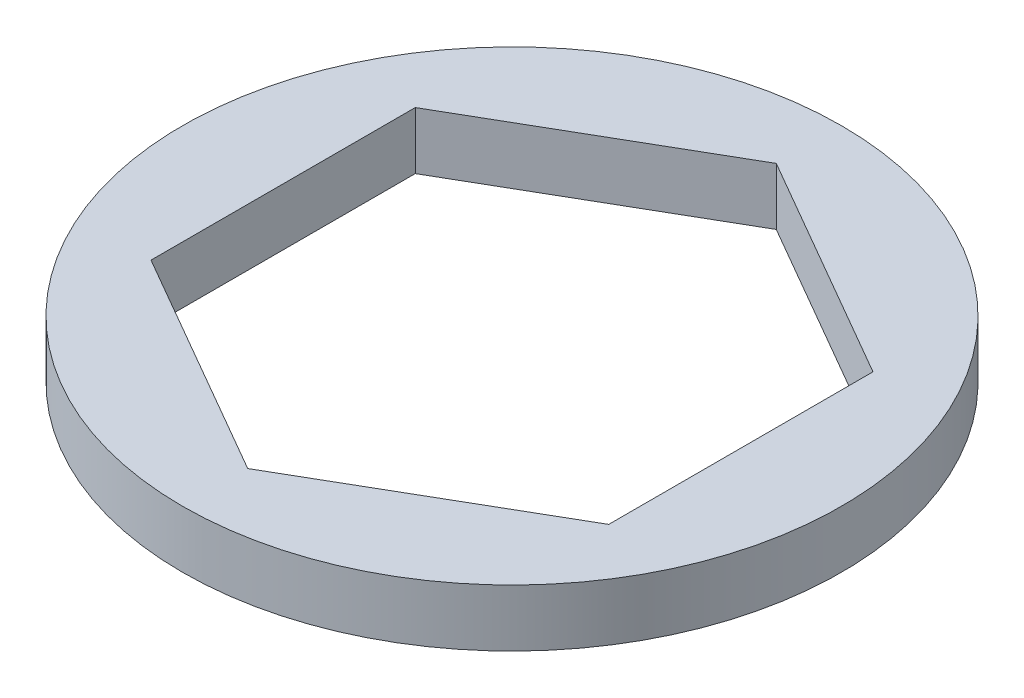
ISO-10303-21;
HEADER;
FILE_DESCRIPTION(('STEP AP214'),'2;1');
FILE_NAME('part.step','',(''),(''),'','','');
FILE_SCHEMA(('AUTOMOTIVE_DESIGN { 1 0 10303 214 1 1 1 1 }'));
ENDSEC;
DATA;
#1=APPLICATION_CONTEXT('core data for automotive mechanical design processes');
#2=APPLICATION_PROTOCOL_DEFINITION('international standard','automotive_design',2000,#1);
#3=PRODUCT_CONTEXT('',#1,'mechanical');
#4=PRODUCT('Part','Part','',(#3));
#5=PRODUCT_RELATED_PRODUCT_CATEGORY('part','',(#4));
#6=PRODUCT_DEFINITION_FORMATION('','',#4);
#7=PRODUCT_DEFINITION_CONTEXT('part definition',#1,'design');
#8=PRODUCT_DEFINITION('design','',#6,#7);
#9=PRODUCT_DEFINITION_SHAPE('','',#8);
#10=(LENGTH_UNIT() NAMED_UNIT(*) SI_UNIT(.MILLI.,.METRE.));
#11=(NAMED_UNIT(*) PLANE_ANGLE_UNIT() SI_UNIT($,.RADIAN.));
#12=(NAMED_UNIT(*) SI_UNIT($,.STERADIAN.) SOLID_ANGLE_UNIT());
#13=UNCERTAINTY_MEASURE_WITH_UNIT(LENGTH_MEASURE(1.E-05),#10,'distance_accuracy_value','');
#14=(GEOMETRIC_REPRESENTATION_CONTEXT(3) GLOBAL_UNCERTAINTY_ASSIGNED_CONTEXT((#13)) GLOBAL_UNIT_ASSIGNED_CONTEXT((#10,
#11,#12)) REPRESENTATION_CONTEXT('',''));
#15=CARTESIAN_POINT('',(0.,0.,0.));
#16=DIRECTION('',(0.,0.,1.));
#17=DIRECTION('',(1.,0.,0.));
#18=AXIS2_PLACEMENT_3D('',#15,#16,#17);
#19=CARTESIAN_POINT('',(0.,1.5875,0.));
#20=DIRECTION('',(0.,1.,0.));
#21=DIRECTION('',(0.,0.,1.));
#22=AXIS2_PLACEMENT_3D('',#19,#20,#21);
#23=PLANE('',#22);
#24=CARTESIAN_POINT('',(0.,1.5875,0.));
#25=DIRECTION('',(0.,1.,0.));
#26=DIRECTION('',(0.,0.,1.));
#27=AXIS2_PLACEMENT_3D('',#24,#25,#26);
#28=CIRCLE('',#27,9.144);
#29=CARTESIAN_POINT('',(0.,1.5875,9.144));
#30=VERTEX_POINT('',#29);
#31=EDGE_CURVE('E11',#30,#30,#28,.T.);
#32=ORIENTED_EDGE('',*,*,#31,.T.);
#33=EDGE_LOOP('',(#32));
#34=FACE_BOUND('',#33,.T.);
#35=DIRECTION('',(0.,0.,-1.));
#36=VECTOR('',#35,1.);
#37=CARTESIAN_POINT('',(6.35,1.5875,3.66617420935412));
#38=LINE('',#37,#36);
#39=CARTESIAN_POINT('',(6.35,1.5875,3.66617420935412));
#40=VERTEX_POINT('',#39);
#41=CARTESIAN_POINT('',(6.35,1.5875,-3.66617420935413));
#42=VERTEX_POINT('',#41);
#43=EDGE_CURVE('E106',#40,#42,#38,.T.);
#44=ORIENTED_EDGE('',*,*,#43,.F.);
#45=DIRECTION('',(0.866025403784438,0.,-0.5));
#46=VECTOR('',#45,1.);
#47=CARTESIAN_POINT('',(0.,1.5875,7.33234841870825));
#48=LINE('',#47,#46);
#49=CARTESIAN_POINT('',(0.,1.5875,7.33234841870825));
#50=VERTEX_POINT('',#49);
#51=EDGE_CURVE('E97',#50,#40,#48,.T.);
#52=ORIENTED_EDGE('',*,*,#51,.F.);
#53=DIRECTION('',(0.866025403784438,0.,0.5));
#54=VECTOR('',#53,1.);
#55=CARTESIAN_POINT('',(-6.35,1.5875,3.66617420935412));
#56=LINE('',#55,#54);
#57=CARTESIAN_POINT('',(-6.35,1.5875,3.66617420935412));
#58=VERTEX_POINT('',#57);
#59=EDGE_CURVE('E131',#58,#50,#56,.T.);
#60=ORIENTED_EDGE('',*,*,#59,.F.);
#61=DIRECTION('',(0.,0.,1.));
#62=VECTOR('',#61,1.);
#63=CARTESIAN_POINT('',(-6.35,1.5875,-3.66617420935412));
#64=LINE('',#63,#62);
#65=CARTESIAN_POINT('',(-6.35,1.5875,-3.66617420935412));
#66=VERTEX_POINT('',#65);
#67=EDGE_CURVE('E128',#66,#58,#64,.T.);
#68=ORIENTED_EDGE('',*,*,#67,.F.);
#69=DIRECTION('',(-0.866025403784439,0.,0.5));
#70=VECTOR('',#69,1.);
#71=CARTESIAN_POINT('',(0.,1.5875,-7.33234841870825));
#72=LINE('',#71,#70);
#73=CARTESIAN_POINT('',(0.,1.5875,-7.33234841870825));
#74=VERTEX_POINT('',#73);
#75=EDGE_CURVE('E123',#74,#66,#72,.T.);
#76=ORIENTED_EDGE('',*,*,#75,.F.);
#77=DIRECTION('',(-0.866025403784439,0.,-0.5));
#78=VECTOR('',#77,1.);
#79=CARTESIAN_POINT('',(6.35,1.5875,-3.66617420935413));
#80=LINE('',#79,#78);
#81=EDGE_CURVE('E119',#42,#74,#80,.T.);
#82=ORIENTED_EDGE('',*,*,#81,.F.);
#83=EDGE_LOOP('',(#44,#52,#60,#68,#76,#82));
#84=FACE_BOUND('',#83,.T.);
#85=ADVANCED_FACE('F43',(#34,#84),#23,.T.);
#86=CARTESIAN_POINT('',(0.,0.,0.));
#87=DIRECTION('',(0.,1.,0.));
#88=DIRECTION('',(0.,0.,1.));
#89=AXIS2_PLACEMENT_3D('',#86,#87,#88);
#90=PLANE('',#89);
#91=CARTESIAN_POINT('',(0.,0.,0.));
#92=DIRECTION('',(0.,1.,0.));
#93=DIRECTION('',(0.,0.,1.));
#94=AXIS2_PLACEMENT_3D('',#91,#92,#93);
#95=CIRCLE('',#94,9.144);
#96=CARTESIAN_POINT('',(0.,0.,9.144));
#97=VERTEX_POINT('',#96);
#98=EDGE_CURVE('E47',#97,#97,#95,.T.);
#99=ORIENTED_EDGE('',*,*,#98,.F.);
#100=EDGE_LOOP('',(#99));
#101=FACE_BOUND('',#100,.T.);
#102=DIRECTION('',(0.866025403784438,0.,-0.5));
#103=VECTOR('',#102,1.);
#104=CARTESIAN_POINT('',(0.,0.,7.33234841870825));
#105=LINE('',#104,#103);
#106=CARTESIAN_POINT('',(0.,0.,7.33234841870825));
#107=VERTEX_POINT('',#106);
#108=CARTESIAN_POINT('',(6.35,0.,3.66617420935412));
#109=VERTEX_POINT('',#108);
#110=EDGE_CURVE('E67',#107,#109,#105,.T.);
#111=ORIENTED_EDGE('',*,*,#110,.T.);
#112=DIRECTION('',(0.,0.,-1.));
#113=VECTOR('',#112,1.);
#114=CARTESIAN_POINT('',(6.35,0.,3.66617420935412));
#115=LINE('',#114,#113);
#116=CARTESIAN_POINT('',(6.35,0.,-3.66617420935413));
#117=VERTEX_POINT('',#116);
#118=EDGE_CURVE('E113',#109,#117,#115,.T.);
#119=ORIENTED_EDGE('',*,*,#118,.T.);
#120=DIRECTION('',(-0.866025403784439,0.,-0.5));
#121=VECTOR('',#120,1.);
#122=CARTESIAN_POINT('',(6.35,0.,-3.66617420935413));
#123=LINE('',#122,#121);
#124=CARTESIAN_POINT('',(0.,0.,-7.33234841870825));
#125=VERTEX_POINT('',#124);
#126=EDGE_CURVE('E138',#117,#125,#123,.T.);
#127=ORIENTED_EDGE('',*,*,#126,.T.);
#128=DIRECTION('',(-0.866025403784439,0.,0.5));
#129=VECTOR('',#128,1.);
#130=CARTESIAN_POINT('',(0.,0.,-7.33234841870825));
#131=LINE('',#130,#129);
#132=CARTESIAN_POINT('',(-6.35,0.,-3.66617420935412));
#133=VERTEX_POINT('',#132);
#134=EDGE_CURVE('E142',#125,#133,#131,.T.);
#135=ORIENTED_EDGE('',*,*,#134,.T.);
#136=DIRECTION('',(0.,0.,1.));
#137=VECTOR('',#136,1.);
#138=CARTESIAN_POINT('',(-6.35,0.,-3.66617420935412));
#139=LINE('',#138,#137);
#140=CARTESIAN_POINT('',(-6.35,0.,3.66617420935412));
#141=VERTEX_POINT('',#140);
#142=EDGE_CURVE('E146',#133,#141,#139,.T.);
#143=ORIENTED_EDGE('',*,*,#142,.T.);
#144=DIRECTION('',(0.866025403784438,0.,0.5));
#145=VECTOR('',#144,1.);
#146=CARTESIAN_POINT('',(-6.35,0.,3.66617420935412));
#147=LINE('',#146,#145);
#148=EDGE_CURVE('E107',#141,#107,#147,.T.);
#149=ORIENTED_EDGE('',*,*,#148,.T.);
#150=EDGE_LOOP('',(#111,#119,#127,#135,#143,#149));
#151=FACE_BOUND('',#150,.T.);
#152=ADVANCED_FACE('F170',(#101,#151),#90,.F.);
#153=CARTESIAN_POINT('',(0.,1.5875,0.));
#154=DIRECTION('',(0.,-1.,0.));
#155=DIRECTION('',(0.,0.,-1.));
#156=AXIS2_PLACEMENT_3D('',#153,#154,#155);
#157=CYLINDRICAL_SURFACE('',#156,9.144);
#158=ORIENTED_EDGE('',*,*,#31,.F.);
#159=EDGE_LOOP('',(#158));
#160=FACE_BOUND('',#159,.T.);
#161=ORIENTED_EDGE('',*,*,#98,.T.);
#162=EDGE_LOOP('',(#161));
#163=FACE_BOUND('',#162,.T.);
#164=ADVANCED_FACE('F45',(#160,#163),#157,.T.);
#165=CARTESIAN_POINT('',(0.,1.5875,7.33234841870825));
#166=DIRECTION('',(-0.5,0.,-0.866025403784438));
#167=DIRECTION('',(-0.866025403784438,0.,0.5));
#168=AXIS2_PLACEMENT_3D('',#165,#166,#167);
#169=PLANE('',#168);
#170=ORIENTED_EDGE('',*,*,#110,.F.);
#171=DIRECTION('',(0.,-1.,0.));
#172=VECTOR('',#171,1.);
#173=CARTESIAN_POINT('',(0.,1.5875,7.33234841870825));
#174=LINE('',#173,#172);
#175=EDGE_CURVE('E101',#50,#107,#174,.T.);
#176=ORIENTED_EDGE('',*,*,#175,.F.);
#177=ORIENTED_EDGE('',*,*,#51,.T.);
#178=DIRECTION('',(0.,-1.,0.));
#179=VECTOR('',#178,1.);
#180=CARTESIAN_POINT('',(6.35,1.5875,3.66617420935412));
#181=LINE('',#180,#179);
#182=EDGE_CURVE('E100',#40,#109,#181,.T.);
#183=ORIENTED_EDGE('',*,*,#182,.T.);
#184=EDGE_LOOP('',(#170,#176,#177,#183));
#185=FACE_BOUND('',#184,.T.);
#186=ADVANCED_FACE('F99',(#185),#169,.T.);
#187=CARTESIAN_POINT('',(6.35,1.5875,3.66617420935412));
#188=DIRECTION('',(-1.,0.,0.));
#189=DIRECTION('',(0.,0.,1.));
#190=AXIS2_PLACEMENT_3D('',#187,#188,#189);
#191=PLANE('',#190);
#192=ORIENTED_EDGE('',*,*,#118,.F.);
#193=ORIENTED_EDGE('',*,*,#182,.F.);
#194=ORIENTED_EDGE('',*,*,#43,.T.);
#195=DIRECTION('',(0.,-1.,0.));
#196=VECTOR('',#195,1.);
#197=CARTESIAN_POINT('',(6.35,1.5875,-3.66617420935413));
#198=LINE('',#197,#196);
#199=EDGE_CURVE('E115',#42,#117,#198,.T.);
#200=ORIENTED_EDGE('',*,*,#199,.T.);
#201=EDGE_LOOP('',(#192,#193,#194,#200));
#202=FACE_BOUND('',#201,.T.);
#203=ADVANCED_FACE('F110',(#202),#191,.T.);
#204=CARTESIAN_POINT('',(6.35,1.5875,-3.66617420935413));
#205=DIRECTION('',(-0.5,0.,0.866025403784439));
#206=DIRECTION('',(0.866025403784439,0.,0.5));
#207=AXIS2_PLACEMENT_3D('',#204,#205,#206);
#208=PLANE('',#207);
#209=ORIENTED_EDGE('',*,*,#126,.F.);
#210=ORIENTED_EDGE('',*,*,#199,.F.);
#211=ORIENTED_EDGE('',*,*,#81,.T.);
#212=DIRECTION('',(0.,-1.,0.));
#213=VECTOR('',#212,1.);
#214=CARTESIAN_POINT('',(0.,1.5875,-7.33234841870825));
#215=LINE('',#214,#213);
#216=EDGE_CURVE('E160',#74,#125,#215,.T.);
#217=ORIENTED_EDGE('',*,*,#216,.T.);
#218=EDGE_LOOP('',(#209,#210,#211,#217));
#219=FACE_BOUND('',#218,.T.);
#220=ADVANCED_FACE('F166',(#219),#208,.T.);
#221=CARTESIAN_POINT('',(0.,1.5875,-7.33234841870825));
#222=DIRECTION('',(0.5,0.,0.866025403784439));
#223=DIRECTION('',(0.866025403784439,0.,-0.5));
#224=AXIS2_PLACEMENT_3D('',#221,#222,#223);
#225=PLANE('',#224);
#226=ORIENTED_EDGE('',*,*,#134,.F.);
#227=ORIENTED_EDGE('',*,*,#216,.F.);
#228=ORIENTED_EDGE('',*,*,#75,.T.);
#229=DIRECTION('',(0.,-1.,0.));
#230=VECTOR('',#229,1.);
#231=CARTESIAN_POINT('',(-6.35,1.5875,-3.66617420935412));
#232=LINE('',#231,#230);
#233=EDGE_CURVE('E157',#66,#133,#232,.T.);
#234=ORIENTED_EDGE('',*,*,#233,.T.);
#235=EDGE_LOOP('',(#226,#227,#228,#234));
#236=FACE_BOUND('',#235,.T.);
#237=ADVANCED_FACE('F178',(#236),#225,.T.);
#238=CARTESIAN_POINT('',(-6.35,1.5875,-3.66617420935412));
#239=DIRECTION('',(1.,0.,0.));
#240=DIRECTION('',(0.,0.,-1.));
#241=AXIS2_PLACEMENT_3D('',#238,#239,#240);
#242=PLANE('',#241);
#243=ORIENTED_EDGE('',*,*,#142,.F.);
#244=ORIENTED_EDGE('',*,*,#233,.F.);
#245=ORIENTED_EDGE('',*,*,#67,.T.);
#246=DIRECTION('',(0.,-1.,0.));
#247=VECTOR('',#246,1.);
#248=CARTESIAN_POINT('',(-6.35,1.5875,3.66617420935412));
#249=LINE('',#248,#247);
#250=EDGE_CURVE('E59',#58,#141,#249,.T.);
#251=ORIENTED_EDGE('',*,*,#250,.T.);
#252=EDGE_LOOP('',(#243,#244,#245,#251));
#253=FACE_BOUND('',#252,.T.);
#254=ADVANCED_FACE('F176',(#253),#242,.T.);
#255=CARTESIAN_POINT('',(-6.35,1.5875,3.66617420935412));
#256=DIRECTION('',(0.5,0.,-0.866025403784438));
#257=DIRECTION('',(-0.866025403784439,0.,-0.5));
#258=AXIS2_PLACEMENT_3D('',#255,#256,#257);
#259=PLANE('',#258);
#260=ORIENTED_EDGE('',*,*,#148,.F.);
#261=ORIENTED_EDGE('',*,*,#250,.F.);
#262=ORIENTED_EDGE('',*,*,#59,.T.);
#263=ORIENTED_EDGE('',*,*,#175,.T.);
#264=EDGE_LOOP('',(#260,#261,#262,#263));
#265=FACE_BOUND('',#264,.T.);
#266=ADVANCED_FACE('F172',(#265),#259,.T.);
#267=CLOSED_SHELL('',(#85,#152,#164,#186,#203,#220,#237,#254,#266));
#268=MANIFOLD_SOLID_BREP('B2',#267);
#269=ADVANCED_BREP_SHAPE_REPRESENTATION('',(#18,#268),#14);
#270=SHAPE_DEFINITION_REPRESENTATION(#9,#269);
ENDSEC;
END-ISO-10303-21;
